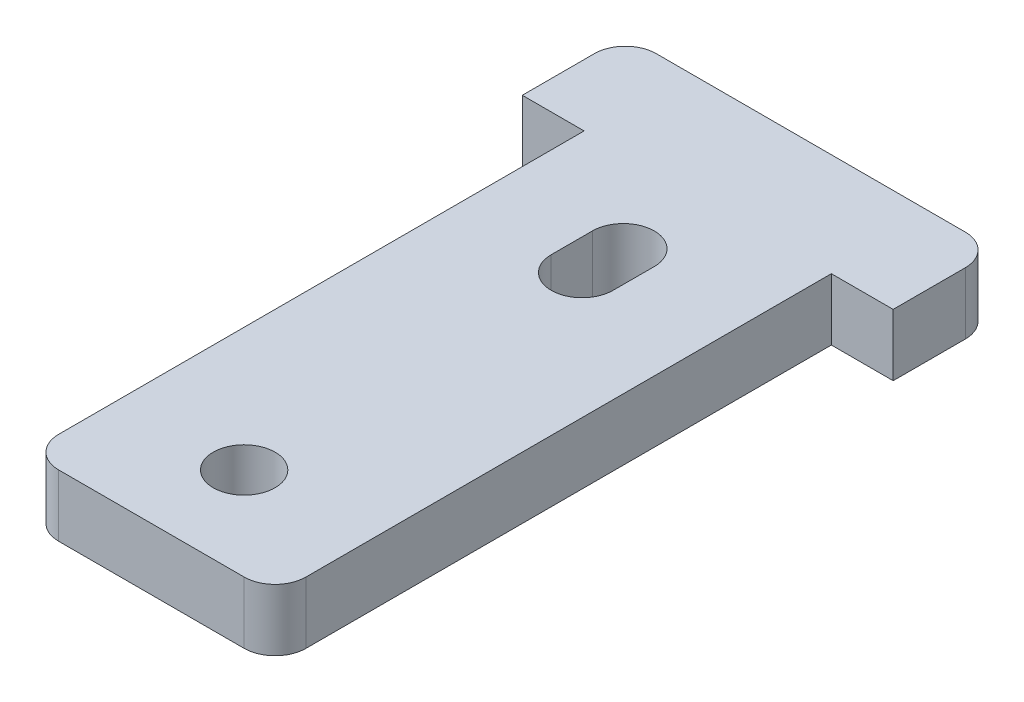
ISO-10303-21;
HEADER;
FILE_DESCRIPTION(('STEP AP214'),'2;1');
FILE_NAME('part.step','',(''),(''),'','','');
FILE_SCHEMA(('AUTOMOTIVE_DESIGN { 1 0 10303 214 1 1 1 1 }'));
ENDSEC;
DATA;
#1=APPLICATION_CONTEXT('core data for automotive mechanical design processes');
#2=APPLICATION_PROTOCOL_DEFINITION('international standard','automotive_design',2000,#1);
#3=PRODUCT_CONTEXT('',#1,'mechanical');
#4=PRODUCT('Part','Part','',(#3));
#5=PRODUCT_RELATED_PRODUCT_CATEGORY('part','',(#4));
#6=PRODUCT_DEFINITION_FORMATION('','',#4);
#7=PRODUCT_DEFINITION_CONTEXT('part definition',#1,'design');
#8=PRODUCT_DEFINITION('design','',#6,#7);
#9=PRODUCT_DEFINITION_SHAPE('','',#8);
#10=(LENGTH_UNIT() NAMED_UNIT(*) SI_UNIT(.MILLI.,.METRE.));
#11=(NAMED_UNIT(*) PLANE_ANGLE_UNIT() SI_UNIT($,.RADIAN.));
#12=(NAMED_UNIT(*) SI_UNIT($,.STERADIAN.) SOLID_ANGLE_UNIT());
#13=UNCERTAINTY_MEASURE_WITH_UNIT(LENGTH_MEASURE(1.E-05),#10,'distance_accuracy_value','');
#14=(GEOMETRIC_REPRESENTATION_CONTEXT(3) GLOBAL_UNCERTAINTY_ASSIGNED_CONTEXT((#13)) GLOBAL_UNIT_ASSIGNED_CONTEXT((#10,
#11,#12)) REPRESENTATION_CONTEXT('',''));
#15=CARTESIAN_POINT('',(0.,0.,0.));
#16=DIRECTION('',(0.,0.,1.));
#17=DIRECTION('',(1.,0.,0.));
#18=AXIS2_PLACEMENT_3D('',#15,#16,#17);
#19=CARTESIAN_POINT('',(0.,3.,0.));
#20=DIRECTION('',(0.,-1.,0.));
#21=DIRECTION('',(0.,0.,-1.));
#22=AXIS2_PLACEMENT_3D('',#19,#20,#21);
#23=PLANE('',#22);
#24=DIRECTION('',(1.,0.,0.));
#25=VECTOR('',#24,1.);
#26=CARTESIAN_POINT('',(0.,3.,0.));
#27=LINE('',#26,#25);
#28=CARTESIAN_POINT('',(4.5,3.,0.));
#29=VERTEX_POINT('',#28);
#30=CARTESIAN_POINT('',(13.5,3.,0.));
#31=VERTEX_POINT('',#30);
#32=EDGE_CURVE('E255',#29,#31,#27,.T.);
#33=ORIENTED_EDGE('',*,*,#32,.T.);
#34=CARTESIAN_POINT('',(13.5,3.,-1.5));
#35=DIRECTION('',(0.,-1.,0.));
#36=DIRECTION('',(0.,0.,-1.));
#37=AXIS2_PLACEMENT_3D('',#34,#35,#36);
#38=CIRCLE('',#37,1.5);
#39=CARTESIAN_POINT('',(15.,3.,-1.5));
#40=VERTEX_POINT('',#39);
#41=EDGE_CURVE('E315',#31,#40,#38,.F.);
#42=ORIENTED_EDGE('',*,*,#41,.T.);
#43=DIRECTION('',(0.,0.,1.));
#44=VECTOR('',#43,1.);
#45=CARTESIAN_POINT('',(15.,3.,0.));
#46=LINE('',#45,#44);
#47=CARTESIAN_POINT('',(15.,3.,-27.));
#48=VERTEX_POINT('',#47);
#49=EDGE_CURVE('E215',#48,#40,#46,.T.);
#50=ORIENTED_EDGE('',*,*,#49,.F.);
#51=DIRECTION('',(-1.,0.,0.));
#52=VECTOR('',#51,1.);
#53=CARTESIAN_POINT('',(18.,3.,-27.));
#54=LINE('',#53,#52);
#55=CARTESIAN_POINT('',(18.,3.,-27.));
#56=VERTEX_POINT('',#55);
#57=EDGE_CURVE('E211',#56,#48,#54,.T.);
#58=ORIENTED_EDGE('',*,*,#57,.F.);
#59=DIRECTION('',(0.,0.,-1.));
#60=VECTOR('',#59,1.);
#61=CARTESIAN_POINT('',(18.,3.,0.));
#62=LINE('',#61,#60);
#63=CARTESIAN_POINT('',(18.,3.,-30.5));
#64=VERTEX_POINT('',#63);
#65=EDGE_CURVE('E260',#56,#64,#62,.T.);
#66=ORIENTED_EDGE('',*,*,#65,.T.);
#67=CARTESIAN_POINT('',(16.5,3.,-30.5));
#68=DIRECTION('',(0.,-1.,0.));
#69=DIRECTION('',(0.,0.,-1.));
#70=AXIS2_PLACEMENT_3D('',#67,#68,#69);
#71=CIRCLE('',#70,1.5);
#72=CARTESIAN_POINT('',(16.5,3.,-32.));
#73=VERTEX_POINT('',#72);
#74=EDGE_CURVE('E299',#64,#73,#71,.F.);
#75=ORIENTED_EDGE('',*,*,#74,.T.);
#76=DIRECTION('',(-1.,0.,0.));
#77=VECTOR('',#76,1.);
#78=CARTESIAN_POINT('',(0.,3.,-32.));
#79=LINE('',#78,#77);
#80=CARTESIAN_POINT('',(1.5,3.,-32.));
#81=VERTEX_POINT('',#80);
#82=EDGE_CURVE('E264',#73,#81,#79,.T.);
#83=ORIENTED_EDGE('',*,*,#82,.T.);
#84=CARTESIAN_POINT('',(1.5,3.,-30.5));
#85=DIRECTION('',(0.,-1.,0.));
#86=DIRECTION('',(0.,0.,-1.));
#87=AXIS2_PLACEMENT_3D('',#84,#85,#86);
#88=CIRCLE('',#87,1.5);
#89=CARTESIAN_POINT('',(0.,3.,-30.5));
#90=VERTEX_POINT('',#89);
#91=EDGE_CURVE('E296',#81,#90,#88,.F.);
#92=ORIENTED_EDGE('',*,*,#91,.T.);
#93=DIRECTION('',(0.,0.,1.));
#94=VECTOR('',#93,1.);
#95=CARTESIAN_POINT('',(0.,3.,0.));
#96=LINE('',#95,#94);
#97=CARTESIAN_POINT('',(0.,3.,-27.));
#98=VERTEX_POINT('',#97);
#99=EDGE_CURVE('E252',#90,#98,#96,.T.);
#100=ORIENTED_EDGE('',*,*,#99,.T.);
#101=DIRECTION('',(-1.,0.,0.));
#102=VECTOR('',#101,1.);
#103=CARTESIAN_POINT('',(0.,3.,-27.));
#104=LINE('',#103,#102);
#105=CARTESIAN_POINT('',(3.,3.,-27.));
#106=VERTEX_POINT('',#105);
#107=EDGE_CURVE('E239',#106,#98,#104,.T.);
#108=ORIENTED_EDGE('',*,*,#107,.F.);
#109=DIRECTION('',(0.,0.,-1.));
#110=VECTOR('',#109,1.);
#111=CARTESIAN_POINT('',(3.,3.,0.));
#112=LINE('',#111,#110);
#113=CARTESIAN_POINT('',(3.,3.,-1.5));
#114=VERTEX_POINT('',#113);
#115=EDGE_CURVE('E236',#114,#106,#112,.T.);
#116=ORIENTED_EDGE('',*,*,#115,.F.);
#117=CARTESIAN_POINT('',(4.5,3.,-1.5));
#118=DIRECTION('',(0.,-1.,0.));
#119=DIRECTION('',(0.,0.,-1.));
#120=AXIS2_PLACEMENT_3D('',#117,#118,#119);
#121=CIRCLE('',#120,1.5);
#122=EDGE_CURVE('E313',#114,#29,#121,.F.);
#123=ORIENTED_EDGE('',*,*,#122,.T.);
#124=EDGE_LOOP('',(#33,#42,#50,#58,#66,#75,#83,#92,#100,#108,#116,#123));
#125=FACE_BOUND('',#124,.T.);
#126=CARTESIAN_POINT('',(9.,3.,-4.5));
#127=DIRECTION('',(0.,1.,0.));
#128=DIRECTION('',(0.,0.,1.));
#129=AXIS2_PLACEMENT_3D('',#126,#127,#128);
#130=CIRCLE('',#129,1.5);
#131=CARTESIAN_POINT('',(9.,3.,-3.));
#132=VERTEX_POINT('',#131);
#133=EDGE_CURVE('E200',#132,#132,#130,.T.);
#134=ORIENTED_EDGE('',*,*,#133,.F.);
#135=EDGE_LOOP('',(#134));
#136=FACE_BOUND('',#135,.T.);
#137=DIRECTION('',(0.,0.,1.));
#138=VECTOR('',#137,1.);
#139=CARTESIAN_POINT('',(10.403583011583,3.,-23.));
#140=LINE('',#139,#138);
#141=CARTESIAN_POINT('',(10.403583011583,3.,-23.));
#142=VERTEX_POINT('',#141);
#143=CARTESIAN_POINT('',(10.403583011583,3.,-21.));
#144=VERTEX_POINT('',#143);
#145=EDGE_CURVE('E55',#142,#144,#140,.T.);
#146=ORIENTED_EDGE('',*,*,#145,.T.);
#147=CARTESIAN_POINT('',(8.90358301158301,3.,-21.));
#148=DIRECTION('',(0.,1.,0.));
#149=DIRECTION('',(0.,0.,1.));
#150=AXIS2_PLACEMENT_3D('',#147,#148,#149);
#151=CIRCLE('',#150,1.5);
#152=CARTESIAN_POINT('',(7.40358301158301,3.,-21.));
#153=VERTEX_POINT('',#152);
#154=EDGE_CURVE('E177',#153,#144,#151,.T.);
#155=ORIENTED_EDGE('',*,*,#154,.F.);
#156=DIRECTION('',(0.,0.,1.));
#157=VECTOR('',#156,1.);
#158=CARTESIAN_POINT('',(7.40358301158301,3.,-23.));
#159=LINE('',#158,#157);
#160=CARTESIAN_POINT('',(7.40358301158301,3.,-23.));
#161=VERTEX_POINT('',#160);
#162=EDGE_CURVE('E187',#161,#153,#159,.T.);
#163=ORIENTED_EDGE('',*,*,#162,.F.);
#164=CARTESIAN_POINT('',(8.90358301158301,3.,-23.));
#165=DIRECTION('',(0.,1.,0.));
#166=DIRECTION('',(0.,0.,1.));
#167=AXIS2_PLACEMENT_3D('',#164,#165,#166);
#168=CIRCLE('',#167,1.5);
#169=EDGE_CURVE('E167',#142,#161,#168,.T.);
#170=ORIENTED_EDGE('',*,*,#169,.F.);
#171=EDGE_LOOP('',(#146,#155,#163,#170));
#172=FACE_BOUND('',#171,.T.);
#173=ADVANCED_FACE('F39',(#125,#136,#172),#23,.F.);
#174=CARTESIAN_POINT('',(0.,0.,0.));
#175=DIRECTION('',(0.,-1.,0.));
#176=DIRECTION('',(0.,0.,-1.));
#177=AXIS2_PLACEMENT_3D('',#174,#175,#176);
#178=PLANE('',#177);
#179=CARTESIAN_POINT('',(9.,0.,-4.5));
#180=DIRECTION('',(0.,-1.,0.));
#181=DIRECTION('',(0.,0.,-1.));
#182=AXIS2_PLACEMENT_3D('',#179,#180,#181);
#183=CIRCLE('',#182,1.5);
#184=CARTESIAN_POINT('',(9.,0.,-3.));
#185=VERTEX_POINT('',#184);
#186=EDGE_CURVE('E160',#185,#185,#183,.F.);
#187=ORIENTED_EDGE('',*,*,#186,.T.);
#188=EDGE_LOOP('',(#187));
#189=FACE_BOUND('',#188,.T.);
#190=DIRECTION('',(0.,0.,1.));
#191=VECTOR('',#190,1.);
#192=CARTESIAN_POINT('',(15.,0.,0.));
#193=LINE('',#192,#191);
#194=CARTESIAN_POINT('',(15.,0.,-27.));
#195=VERTEX_POINT('',#194);
#196=CARTESIAN_POINT('',(15.,0.,-1.5));
#197=VERTEX_POINT('',#196);
#198=EDGE_CURVE('E204',#195,#197,#193,.T.);
#199=ORIENTED_EDGE('',*,*,#198,.T.);
#200=CARTESIAN_POINT('',(13.5,0.,-1.5));
#201=DIRECTION('',(0.,-1.,0.));
#202=DIRECTION('',(0.,0.,-1.));
#203=AXIS2_PLACEMENT_3D('',#200,#201,#202);
#204=CIRCLE('',#203,1.5);
#205=CARTESIAN_POINT('',(13.5,0.,0.));
#206=VERTEX_POINT('',#205);
#207=EDGE_CURVE('E48',#197,#206,#204,.T.);
#208=ORIENTED_EDGE('',*,*,#207,.T.);
#209=DIRECTION('',(1.,0.,0.));
#210=VECTOR('',#209,1.);
#211=CARTESIAN_POINT('',(0.,0.,0.));
#212=LINE('',#211,#210);
#213=CARTESIAN_POINT('',(4.5,0.,0.));
#214=VERTEX_POINT('',#213);
#215=EDGE_CURVE('E270',#214,#206,#212,.T.);
#216=ORIENTED_EDGE('',*,*,#215,.F.);
#217=CARTESIAN_POINT('',(4.5,0.,-1.5));
#218=DIRECTION('',(0.,-1.,0.));
#219=DIRECTION('',(0.,0.,-1.));
#220=AXIS2_PLACEMENT_3D('',#217,#218,#219);
#221=CIRCLE('',#220,1.5);
#222=CARTESIAN_POINT('',(3.,0.,-1.5));
#223=VERTEX_POINT('',#222);
#224=EDGE_CURVE('E321',#214,#223,#221,.T.);
#225=ORIENTED_EDGE('',*,*,#224,.T.);
#226=DIRECTION('',(0.,0.,-1.));
#227=VECTOR('',#226,1.);
#228=CARTESIAN_POINT('',(3.,0.,0.));
#229=LINE('',#228,#227);
#230=CARTESIAN_POINT('',(3.,0.,-27.));
#231=VERTEX_POINT('',#230);
#232=EDGE_CURVE('E229',#223,#231,#229,.T.);
#233=ORIENTED_EDGE('',*,*,#232,.T.);
#234=DIRECTION('',(-1.,0.,0.));
#235=VECTOR('',#234,1.);
#236=CARTESIAN_POINT('',(0.,0.,-27.));
#237=LINE('',#236,#235);
#238=CARTESIAN_POINT('',(0.,0.,-27.));
#239=VERTEX_POINT('',#238);
#240=EDGE_CURVE('E232',#231,#239,#237,.T.);
#241=ORIENTED_EDGE('',*,*,#240,.T.);
#242=DIRECTION('',(0.,0.,1.));
#243=VECTOR('',#242,1.);
#244=CARTESIAN_POINT('',(0.,0.,0.));
#245=LINE('',#244,#243);
#246=CARTESIAN_POINT('',(0.,0.,-30.5));
#247=VERTEX_POINT('',#246);
#248=EDGE_CURVE('E248',#247,#239,#245,.T.);
#249=ORIENTED_EDGE('',*,*,#248,.F.);
#250=CARTESIAN_POINT('',(1.5,0.,-30.5));
#251=DIRECTION('',(0.,-1.,0.));
#252=DIRECTION('',(0.,0.,-1.));
#253=AXIS2_PLACEMENT_3D('',#250,#251,#252);
#254=CIRCLE('',#253,1.5);
#255=CARTESIAN_POINT('',(1.5,0.,-32.));
#256=VERTEX_POINT('',#255);
#257=EDGE_CURVE('E287',#247,#256,#254,.T.);
#258=ORIENTED_EDGE('',*,*,#257,.T.);
#259=DIRECTION('',(-1.,0.,0.));
#260=VECTOR('',#259,1.);
#261=CARTESIAN_POINT('',(0.,0.,-32.));
#262=LINE('',#261,#260);
#263=CARTESIAN_POINT('',(16.5,0.,-32.));
#264=VERTEX_POINT('',#263);
#265=EDGE_CURVE('E256',#264,#256,#262,.T.);
#266=ORIENTED_EDGE('',*,*,#265,.F.);
#267=CARTESIAN_POINT('',(16.5,0.,-30.5));
#268=DIRECTION('',(0.,-1.,0.));
#269=DIRECTION('',(0.,0.,-1.));
#270=AXIS2_PLACEMENT_3D('',#267,#268,#269);
#271=CIRCLE('',#270,1.5);
#272=CARTESIAN_POINT('',(18.,0.,-30.5));
#273=VERTEX_POINT('',#272);
#274=EDGE_CURVE('E290',#264,#273,#271,.T.);
#275=ORIENTED_EDGE('',*,*,#274,.T.);
#276=DIRECTION('',(0.,0.,-1.));
#277=VECTOR('',#276,1.);
#278=CARTESIAN_POINT('',(18.,0.,0.));
#279=LINE('',#278,#277);
#280=CARTESIAN_POINT('',(18.,0.,-27.));
#281=VERTEX_POINT('',#280);
#282=EDGE_CURVE('E274',#281,#273,#279,.T.);
#283=ORIENTED_EDGE('',*,*,#282,.F.);
#284=DIRECTION('',(-1.,0.,0.));
#285=VECTOR('',#284,1.);
#286=CARTESIAN_POINT('',(18.,0.,-27.));
#287=LINE('',#286,#285);
#288=EDGE_CURVE('E223',#281,#195,#287,.T.);
#289=ORIENTED_EDGE('',*,*,#288,.T.);
#290=EDGE_LOOP('',(#199,#208,#216,#225,#233,#241,#249,#258,#266,#275,#283,#289));
#291=FACE_BOUND('',#290,.T.);
#292=CARTESIAN_POINT('',(8.90358301158301,0.,-21.));
#293=DIRECTION('',(0.,-1.,0.));
#294=DIRECTION('',(0.,0.,-1.));
#295=AXIS2_PLACEMENT_3D('',#292,#293,#294);
#296=CIRCLE('',#295,1.5);
#297=CARTESIAN_POINT('',(7.40358301158301,0.,-21.));
#298=VERTEX_POINT('',#297);
#299=CARTESIAN_POINT('',(10.403583011583,0.,-21.));
#300=VERTEX_POINT('',#299);
#301=EDGE_CURVE('E171',#298,#300,#296,.F.);
#302=ORIENTED_EDGE('',*,*,#301,.T.);
#303=DIRECTION('',(0.,0.,1.));
#304=VECTOR('',#303,1.);
#305=CARTESIAN_POINT('',(10.403583011583,0.,-23.));
#306=LINE('',#305,#304);
#307=CARTESIAN_POINT('',(10.403583011583,0.,-23.));
#308=VERTEX_POINT('',#307);
#309=EDGE_CURVE('E164',#308,#300,#306,.T.);
#310=ORIENTED_EDGE('',*,*,#309,.F.);
#311=CARTESIAN_POINT('',(8.90358301158301,0.,-23.));
#312=DIRECTION('',(0.,-1.,0.));
#313=DIRECTION('',(0.,0.,-1.));
#314=AXIS2_PLACEMENT_3D('',#311,#312,#313);
#315=CIRCLE('',#314,1.5);
#316=CARTESIAN_POINT('',(7.40358301158301,0.,-23.));
#317=VERTEX_POINT('',#316);
#318=EDGE_CURVE('E152',#308,#317,#315,.F.);
#319=ORIENTED_EDGE('',*,*,#318,.T.);
#320=DIRECTION('',(0.,0.,1.));
#321=VECTOR('',#320,1.);
#322=CARTESIAN_POINT('',(7.40358301158301,0.,-23.));
#323=LINE('',#322,#321);
#324=EDGE_CURVE('E180',#317,#298,#323,.T.);
#325=ORIENTED_EDGE('',*,*,#324,.T.);
#326=EDGE_LOOP('',(#302,#310,#319,#325));
#327=FACE_BOUND('',#326,.T.);
#328=ADVANCED_FACE('F170',(#189,#291,#327),#178,.T.);
#329=CARTESIAN_POINT('',(0.,3.,0.));
#330=DIRECTION('',(1.,0.,0.));
#331=DIRECTION('',(0.,0.,-1.));
#332=AXIS2_PLACEMENT_3D('',#329,#330,#331);
#333=PLANE('',#332);
#334=ORIENTED_EDGE('',*,*,#99,.F.);
#335=DIRECTION('',(0.,-1.,0.));
#336=VECTOR('',#335,1.);
#337=CARTESIAN_POINT('',(0.,3.,-30.5));
#338=LINE('',#337,#336);
#339=EDGE_CURVE('E302',#90,#247,#338,.T.);
#340=ORIENTED_EDGE('',*,*,#339,.T.);
#341=ORIENTED_EDGE('',*,*,#248,.T.);
#342=DIRECTION('',(0.,1.,0.));
#343=VECTOR('',#342,1.);
#344=CARTESIAN_POINT('',(0.,-0.00100000000000013,-27.));
#345=LINE('',#344,#343);
#346=EDGE_CURVE('E244',#239,#98,#345,.T.);
#347=ORIENTED_EDGE('',*,*,#346,.T.);
#348=EDGE_LOOP('',(#334,#340,#341,#347));
#349=FACE_BOUND('',#348,.T.);
#350=ADVANCED_FACE('F367',(#349),#333,.F.);
#351=CARTESIAN_POINT('',(0.,3.,0.));
#352=DIRECTION('',(0.,0.,-1.));
#353=DIRECTION('',(-1.,0.,0.));
#354=AXIS2_PLACEMENT_3D('',#351,#352,#353);
#355=PLANE('',#354);
#356=ORIENTED_EDGE('',*,*,#215,.T.);
#357=DIRECTION('',(0.,1.,0.));
#358=VECTOR('',#357,1.);
#359=CARTESIAN_POINT('',(13.5,3.,0.));
#360=LINE('',#359,#358);
#361=EDGE_CURVE('E309',#206,#31,#360,.T.);
#362=ORIENTED_EDGE('',*,*,#361,.T.);
#363=ORIENTED_EDGE('',*,*,#32,.F.);
#364=DIRECTION('',(0.,1.,0.));
#365=VECTOR('',#364,1.);
#366=CARTESIAN_POINT('',(4.5,3.,0.));
#367=LINE('',#366,#365);
#368=EDGE_CURVE('E306',#29,#214,#367,.F.);
#369=ORIENTED_EDGE('',*,*,#368,.T.);
#370=EDGE_LOOP('',(#356,#362,#363,#369));
#371=FACE_BOUND('',#370,.T.);
#372=ADVANCED_FACE('F333',(#371),#355,.F.);
#373=CARTESIAN_POINT('',(18.,3.,0.));
#374=DIRECTION('',(-1.,0.,0.));
#375=DIRECTION('',(0.,0.,1.));
#376=AXIS2_PLACEMENT_3D('',#373,#374,#375);
#377=PLANE('',#376);
#378=ORIENTED_EDGE('',*,*,#282,.T.);
#379=DIRECTION('',(0.,-1.,0.));
#380=VECTOR('',#379,1.);
#381=CARTESIAN_POINT('',(18.,3.,-30.5));
#382=LINE('',#381,#380);
#383=EDGE_CURVE('E293',#273,#64,#382,.F.);
#384=ORIENTED_EDGE('',*,*,#383,.T.);
#385=ORIENTED_EDGE('',*,*,#65,.F.);
#386=DIRECTION('',(0.,1.,0.));
#387=VECTOR('',#386,1.);
#388=CARTESIAN_POINT('',(18.,-0.00100000000000013,-27.));
#389=LINE('',#388,#387);
#390=EDGE_CURVE('E219',#281,#56,#389,.T.);
#391=ORIENTED_EDGE('',*,*,#390,.F.);
#392=EDGE_LOOP('',(#378,#384,#385,#391));
#393=FACE_BOUND('',#392,.T.);
#394=ADVANCED_FACE('F349',(#393),#377,.F.);
#395=CARTESIAN_POINT('',(0.,3.,-32.));
#396=DIRECTION('',(0.,0.,1.));
#397=DIRECTION('',(1.,0.,0.));
#398=AXIS2_PLACEMENT_3D('',#395,#396,#397);
#399=PLANE('',#398);
#400=ORIENTED_EDGE('',*,*,#82,.F.);
#401=DIRECTION('',(0.,-1.,0.));
#402=VECTOR('',#401,1.);
#403=CARTESIAN_POINT('',(16.5,3.,-32.));
#404=LINE('',#403,#402);
#405=EDGE_CURVE('E283',#73,#264,#404,.T.);
#406=ORIENTED_EDGE('',*,*,#405,.T.);
#407=ORIENTED_EDGE('',*,*,#265,.T.);
#408=DIRECTION('',(0.,-1.,0.));
#409=VECTOR('',#408,1.);
#410=CARTESIAN_POINT('',(1.5,3.,-32.));
#411=LINE('',#410,#409);
#412=EDGE_CURVE('E268',#256,#81,#411,.F.);
#413=ORIENTED_EDGE('',*,*,#412,.T.);
#414=EDGE_LOOP('',(#400,#406,#407,#413));
#415=FACE_BOUND('',#414,.T.);
#416=ADVANCED_FACE('F358',(#415),#399,.F.);
#417=CARTESIAN_POINT('',(0.,-0.00100000000000013,-27.));
#418=DIRECTION('',(0.,0.,-1.));
#419=DIRECTION('',(-1.,0.,0.));
#420=AXIS2_PLACEMENT_3D('',#417,#418,#419);
#421=PLANE('',#420);
#422=DIRECTION('',(0.,1.,0.));
#423=VECTOR('',#422,1.);
#424=CARTESIAN_POINT('',(3.,-0.00100000000000013,-27.));
#425=LINE('',#424,#423);
#426=EDGE_CURVE('E243',#231,#106,#425,.T.);
#427=ORIENTED_EDGE('',*,*,#426,.T.);
#428=ORIENTED_EDGE('',*,*,#107,.T.);
#429=ORIENTED_EDGE('',*,*,#346,.F.);
#430=ORIENTED_EDGE('',*,*,#240,.F.);
#431=EDGE_LOOP('',(#427,#428,#429,#430));
#432=FACE_BOUND('',#431,.T.);
#433=ADVANCED_FACE('F372',(#432),#421,.F.);
#434=CARTESIAN_POINT('',(3.,-0.00100000000000013,0.));
#435=DIRECTION('',(1.,0.,0.));
#436=DIRECTION('',(0.,0.,-1.));
#437=AXIS2_PLACEMENT_3D('',#434,#435,#436);
#438=PLANE('',#437);
#439=ORIENTED_EDGE('',*,*,#232,.F.);
#440=DIRECTION('',(0.,1.,0.));
#441=VECTOR('',#440,1.);
#442=CARTESIAN_POINT('',(3.,-0.00100000000000013,-1.5));
#443=LINE('',#442,#441);
#444=EDGE_CURVE('E11',#223,#114,#443,.T.);
#445=ORIENTED_EDGE('',*,*,#444,.T.);
#446=ORIENTED_EDGE('',*,*,#115,.T.);
#447=ORIENTED_EDGE('',*,*,#426,.F.);
#448=EDGE_LOOP('',(#439,#445,#446,#447));
#449=FACE_BOUND('',#448,.T.);
#450=ADVANCED_FACE('F377',(#449),#438,.F.);
#451=CARTESIAN_POINT('',(15.,-0.00100000000000013,0.));
#452=DIRECTION('',(-1.,0.,0.));
#453=DIRECTION('',(0.,0.,1.));
#454=AXIS2_PLACEMENT_3D('',#451,#452,#453);
#455=PLANE('',#454);
#456=ORIENTED_EDGE('',*,*,#49,.T.);
#457=DIRECTION('',(0.,1.,0.));
#458=VECTOR('',#457,1.);
#459=CARTESIAN_POINT('',(15.,-0.00100000000000013,-1.5));
#460=LINE('',#459,#458);
#461=EDGE_CURVE('E318',#40,#197,#460,.F.);
#462=ORIENTED_EDGE('',*,*,#461,.T.);
#463=ORIENTED_EDGE('',*,*,#198,.F.);
#464=DIRECTION('',(0.,1.,0.));
#465=VECTOR('',#464,1.);
#466=CARTESIAN_POINT('',(15.,-0.00100000000000013,-27.));
#467=LINE('',#466,#465);
#468=EDGE_CURVE('E220',#195,#48,#467,.T.);
#469=ORIENTED_EDGE('',*,*,#468,.T.);
#470=EDGE_LOOP('',(#456,#462,#463,#469));
#471=FACE_BOUND('',#470,.T.);
#472=ADVANCED_FACE('F342',(#471),#455,.F.);
#473=CARTESIAN_POINT('',(18.,-0.00100000000000013,-27.));
#474=DIRECTION('',(0.,0.,-1.));
#475=DIRECTION('',(-1.,0.,0.));
#476=AXIS2_PLACEMENT_3D('',#473,#474,#475);
#477=PLANE('',#476);
#478=ORIENTED_EDGE('',*,*,#390,.T.);
#479=ORIENTED_EDGE('',*,*,#57,.T.);
#480=ORIENTED_EDGE('',*,*,#468,.F.);
#481=ORIENTED_EDGE('',*,*,#288,.F.);
#482=EDGE_LOOP('',(#478,#479,#480,#481));
#483=FACE_BOUND('',#482,.T.);
#484=ADVANCED_FACE('F344',(#483),#477,.F.);
#485=CARTESIAN_POINT('',(9.,-0.00100000000000013,-4.5));
#486=DIRECTION('',(0.,1.,0.));
#487=DIRECTION('',(0.,0.,1.));
#488=AXIS2_PLACEMENT_3D('',#485,#486,#487);
#489=CYLINDRICAL_SURFACE('',#488,1.5);
#490=CARTESIAN_POINT('',(9.,0.,-3.));
#491=CARTESIAN_POINT('',(9.,0.03125,-3.));
#492=CARTESIAN_POINT('',(9.,0.0625,-3.));
#493=CARTESIAN_POINT('',(9.,0.125,-3.));
#494=CARTESIAN_POINT('',(9.,0.15625,-3.));
#495=CARTESIAN_POINT('',(9.,0.21875,-3.));
#496=CARTESIAN_POINT('',(9.,0.25,-3.));
#497=CARTESIAN_POINT('',(9.,0.3125,-3.));
#498=CARTESIAN_POINT('',(9.,0.34375,-3.));
#499=CARTESIAN_POINT('',(9.,0.40625,-3.));
#500=CARTESIAN_POINT('',(9.,0.4375,-3.));
#501=CARTESIAN_POINT('',(9.,0.5,-3.));
#502=CARTESIAN_POINT('',(9.,0.53125,-3.));
#503=CARTESIAN_POINT('',(9.,0.59375,-3.));
#504=CARTESIAN_POINT('',(9.,0.625,-3.));
#505=CARTESIAN_POINT('',(9.,0.6875,-3.));
#506=CARTESIAN_POINT('',(9.,0.71875,-3.));
#507=CARTESIAN_POINT('',(9.,0.78125,-3.));
#508=CARTESIAN_POINT('',(9.,0.8125,-3.));
#509=CARTESIAN_POINT('',(9.,0.875,-3.));
#510=CARTESIAN_POINT('',(9.,0.90625,-3.));
#511=CARTESIAN_POINT('',(9.,0.96875,-3.));
#512=CARTESIAN_POINT('',(9.,1.,-3.));
#513=CARTESIAN_POINT('',(9.,1.0625,-3.));
#514=CARTESIAN_POINT('',(9.,1.09375,-3.));
#515=CARTESIAN_POINT('',(9.,1.15625,-3.));
#516=CARTESIAN_POINT('',(9.,1.1875,-3.));
#517=CARTESIAN_POINT('',(9.,1.25,-3.));
#518=CARTESIAN_POINT('',(9.,1.28125,-3.));
#519=CARTESIAN_POINT('',(9.,1.34375,-3.));
#520=CARTESIAN_POINT('',(9.,1.375,-3.));
#521=CARTESIAN_POINT('',(9.,1.4375,-3.));
#522=CARTESIAN_POINT('',(9.,1.46875,-3.));
#523=CARTESIAN_POINT('',(9.,1.53125,-3.));
#524=CARTESIAN_POINT('',(9.,1.5625,-3.));
#525=CARTESIAN_POINT('',(9.,1.625,-3.));
#526=CARTESIAN_POINT('',(9.,1.65625,-3.));
#527=CARTESIAN_POINT('',(9.,1.71875,-3.));
#528=CARTESIAN_POINT('',(9.,1.75,-3.));
#529=CARTESIAN_POINT('',(9.,1.8125,-3.));
#530=CARTESIAN_POINT('',(9.,1.84375,-3.));
#531=CARTESIAN_POINT('',(9.,1.90625,-3.));
#532=CARTESIAN_POINT('',(9.,1.9375,-3.));
#533=CARTESIAN_POINT('',(9.,2.,-3.));
#534=CARTESIAN_POINT('',(9.,2.03125,-3.));
#535=CARTESIAN_POINT('',(9.,2.09375,-3.));
#536=CARTESIAN_POINT('',(9.,2.125,-3.));
#537=CARTESIAN_POINT('',(9.,2.1875,-3.));
#538=CARTESIAN_POINT('',(9.,2.21875,-3.));
#539=CARTESIAN_POINT('',(9.,2.28125,-3.));
#540=CARTESIAN_POINT('',(9.,2.3125,-3.));
#541=CARTESIAN_POINT('',(9.,2.375,-3.));
#542=CARTESIAN_POINT('',(9.,2.40625,-3.));
#543=CARTESIAN_POINT('',(9.,2.46875,-3.));
#544=CARTESIAN_POINT('',(9.,2.5,-3.));
#545=CARTESIAN_POINT('',(9.,2.5625,-3.));
#546=CARTESIAN_POINT('',(9.,2.59375,-3.));
#547=CARTESIAN_POINT('',(9.,2.65625,-3.));
#548=CARTESIAN_POINT('',(9.,2.6875,-3.));
#549=CARTESIAN_POINT('',(9.,2.75,-3.));
#550=CARTESIAN_POINT('',(9.,2.78125,-3.));
#551=CARTESIAN_POINT('',(9.,2.84375,-3.));
#552=CARTESIAN_POINT('',(9.,2.875,-3.));
#553=CARTESIAN_POINT('',(9.,2.9375,-3.));
#554=CARTESIAN_POINT('',(9.,2.96875,-3.));
#555=CARTESIAN_POINT('',(9.,3.,-3.));
#556=B_SPLINE_CURVE_WITH_KNOTS('',3,(#490,#491,#492,#493,#494,#495,#496,#497,#498,#499,#500,
#501,#502,#503,#504,#505,#506,#507,#508,#509,#510,#511,#512,#513,#514,#515,#516,#517,#518,#519,
#520,#521,#522,#523,#524,#525,#526,#527,#528,#529,#530,#531,#532,#533,#534,#535,#536,#537,#538,
#539,#540,#541,#542,#543,#544,#545,#546,#547,#548,#549,#550,#551,#552,#553,#554,#555),
.UNSPECIFIED.,.F.,.F.,(4,2,2,2,2,2,2,2,2,2,2,2,2,2,2,2,2,2,2,2,2,2,2,2,2,2,2,2,2,2,2,2,4),(0.,
0.09375,0.1875,0.28125,0.375,0.46875,0.5625,0.65625,0.75,0.84375,0.9375,1.03125,1.125,1.21875,
1.3125,1.40625,1.5,1.59375,1.6875,1.78125,1.875,1.96875,2.0625,2.15625,2.25,2.34375,2.4375,
2.53125,2.625,2.71875,2.8125,2.90625,3.),.UNSPECIFIED.);
#557=EDGE_CURVE('BSEAM407',#185,#132,#556,.T.);
#558=ORIENTED_EDGE('',*,*,#186,.F.);
#559=ORIENTED_EDGE('',*,*,#133,.T.);
#560=ORIENTED_EDGE('',*,*,#557,.T.);
#561=ORIENTED_EDGE('',*,*,#557,.F.);
#562=EDGE_LOOP('',(#558,#560,#559,#561));
#563=FACE_BOUND('',#562,.T.);
#564=ADVANCED_FACE('F407',(#563),#489,.F.);
#565=CARTESIAN_POINT('',(16.5,3.,-30.5));
#566=DIRECTION('',(0.,-1.,0.));
#567=DIRECTION('',(0.,0.,-1.));
#568=AXIS2_PLACEMENT_3D('',#565,#566,#567);
#569=CYLINDRICAL_SURFACE('',#568,1.5);
#570=ORIENTED_EDGE('',*,*,#74,.F.);
#571=ORIENTED_EDGE('',*,*,#383,.F.);
#572=ORIENTED_EDGE('',*,*,#274,.F.);
#573=ORIENTED_EDGE('',*,*,#405,.F.);
#574=EDGE_LOOP('',(#570,#571,#572,#573));
#575=FACE_BOUND('',#574,.T.);
#576=ADVANCED_FACE('F353',(#575),#569,.T.);
#577=CARTESIAN_POINT('',(1.5,3.,-30.5));
#578=DIRECTION('',(0.,-1.,0.));
#579=DIRECTION('',(0.,0.,-1.));
#580=AXIS2_PLACEMENT_3D('',#577,#578,#579);
#581=CYLINDRICAL_SURFACE('',#580,1.5);
#582=ORIENTED_EDGE('',*,*,#91,.F.);
#583=ORIENTED_EDGE('',*,*,#412,.F.);
#584=ORIENTED_EDGE('',*,*,#257,.F.);
#585=ORIENTED_EDGE('',*,*,#339,.F.);
#586=EDGE_LOOP('',(#582,#583,#584,#585));
#587=FACE_BOUND('',#586,.T.);
#588=ADVANCED_FACE('F362',(#587),#581,.T.);
#589=CARTESIAN_POINT('',(13.5,3.,-1.5));
#590=DIRECTION('',(0.,1.,0.));
#591=DIRECTION('',(0.,0.,1.));
#592=AXIS2_PLACEMENT_3D('',#589,#590,#591);
#593=CYLINDRICAL_SURFACE('',#592,1.5);
#594=ORIENTED_EDGE('',*,*,#207,.F.);
#595=ORIENTED_EDGE('',*,*,#461,.F.);
#596=ORIENTED_EDGE('',*,*,#41,.F.);
#597=ORIENTED_EDGE('',*,*,#361,.F.);
#598=EDGE_LOOP('',(#594,#595,#596,#597));
#599=FACE_BOUND('',#598,.T.);
#600=ADVANCED_FACE('F336',(#599),#593,.T.);
#601=CARTESIAN_POINT('',(4.5,-0.00100000000000013,-1.5));
#602=DIRECTION('',(0.,1.,0.));
#603=DIRECTION('',(0.,0.,1.));
#604=AXIS2_PLACEMENT_3D('',#601,#602,#603);
#605=CYLINDRICAL_SURFACE('',#604,1.5);
#606=ORIENTED_EDGE('',*,*,#224,.F.);
#607=ORIENTED_EDGE('',*,*,#368,.F.);
#608=ORIENTED_EDGE('',*,*,#122,.F.);
#609=ORIENTED_EDGE('',*,*,#444,.F.);
#610=EDGE_LOOP('',(#606,#607,#608,#609));
#611=FACE_BOUND('',#610,.T.);
#612=ADVANCED_FACE('F41',(#611),#605,.T.);
#613=CARTESIAN_POINT('',(10.403583011583,-0.00100000000000013,-23.));
#614=DIRECTION('',(-1.,0.,0.));
#615=DIRECTION('',(0.,0.,1.));
#616=AXIS2_PLACEMENT_3D('',#613,#614,#615);
#617=PLANE('',#616);
#618=ORIENTED_EDGE('',*,*,#309,.T.);
#619=DIRECTION('',(0.,1.,0.));
#620=VECTOR('',#619,1.);
#621=CARTESIAN_POINT('',(10.403583011583,-0.00100000000000013,-21.));
#622=LINE('',#621,#620);
#623=EDGE_CURVE('E161',#300,#144,#622,.T.);
#624=ORIENTED_EDGE('',*,*,#623,.T.);
#625=ORIENTED_EDGE('',*,*,#145,.F.);
#626=DIRECTION('',(0.,1.,0.));
#627=VECTOR('',#626,1.);
#628=CARTESIAN_POINT('',(10.403583011583,-0.00100000000000013,-23.));
#629=LINE('',#628,#627);
#630=EDGE_CURVE('E154',#308,#142,#629,.T.);
#631=ORIENTED_EDGE('',*,*,#630,.F.);
#632=EDGE_LOOP('',(#618,#624,#625,#631));
#633=FACE_BOUND('',#632,.T.);
#634=ADVANCED_FACE('F163',(#633),#617,.T.);
#635=CARTESIAN_POINT('',(8.90358301158301,-0.00100000000000013,-21.));
#636=DIRECTION('',(0.,1.,0.));
#637=DIRECTION('',(0.,0.,1.));
#638=AXIS2_PLACEMENT_3D('',#635,#636,#637);
#639=CYLINDRICAL_SURFACE('',#638,1.5);
#640=DIRECTION('',(0.,1.,0.));
#641=VECTOR('',#640,1.);
#642=CARTESIAN_POINT('',(7.40358301158301,-0.00100000000000013,-21.));
#643=LINE('',#642,#641);
#644=EDGE_CURVE('E195',#298,#153,#643,.T.);
#645=ORIENTED_EDGE('',*,*,#644,.T.);
#646=ORIENTED_EDGE('',*,*,#154,.T.);
#647=ORIENTED_EDGE('',*,*,#623,.F.);
#648=ORIENTED_EDGE('',*,*,#301,.F.);
#649=EDGE_LOOP('',(#645,#646,#647,#648));
#650=FACE_BOUND('',#649,.T.);
#651=ADVANCED_FACE('F385',(#650),#639,.F.);
#652=CARTESIAN_POINT('',(7.40358301158301,-0.00100000000000013,-23.));
#653=DIRECTION('',(-1.,0.,0.));
#654=DIRECTION('',(0.,0.,1.));
#655=AXIS2_PLACEMENT_3D('',#652,#653,#654);
#656=PLANE('',#655);
#657=DIRECTION('',(0.,1.,0.));
#658=VECTOR('',#657,1.);
#659=CARTESIAN_POINT('',(7.40358301158301,-0.00100000000000013,-23.));
#660=LINE('',#659,#658);
#661=EDGE_CURVE('E63',#317,#161,#660,.T.);
#662=ORIENTED_EDGE('',*,*,#661,.T.);
#663=ORIENTED_EDGE('',*,*,#162,.T.);
#664=ORIENTED_EDGE('',*,*,#644,.F.);
#665=ORIENTED_EDGE('',*,*,#324,.F.);
#666=EDGE_LOOP('',(#662,#663,#664,#665));
#667=FACE_BOUND('',#666,.T.);
#668=ADVANCED_FACE('F435',(#667),#656,.F.);
#669=CARTESIAN_POINT('',(8.90358301158301,-0.00100000000000013,-23.));
#670=DIRECTION('',(0.,1.,0.));
#671=DIRECTION('',(0.,0.,1.));
#672=AXIS2_PLACEMENT_3D('',#669,#670,#671);
#673=CYLINDRICAL_SURFACE('',#672,1.5);
#674=ORIENTED_EDGE('',*,*,#630,.T.);
#675=ORIENTED_EDGE('',*,*,#169,.T.);
#676=ORIENTED_EDGE('',*,*,#661,.F.);
#677=ORIENTED_EDGE('',*,*,#318,.F.);
#678=EDGE_LOOP('',(#674,#675,#676,#677));
#679=FACE_BOUND('',#678,.T.);
#680=ADVANCED_FACE('F153',(#679),#673,.F.);
#681=CLOSED_SHELL('',(#173,#328,#350,#372,#394,#416,#433,#450,#472,#484,#564,#576,#588,#600,
#612,#634,#651,#668,#680));
#682=MANIFOLD_SOLID_BREP('B2',#681);
#683=ADVANCED_BREP_SHAPE_REPRESENTATION('',(#18,#682),#14);
#684=SHAPE_DEFINITION_REPRESENTATION(#9,#683);
ENDSEC;
END-ISO-10303-21;
